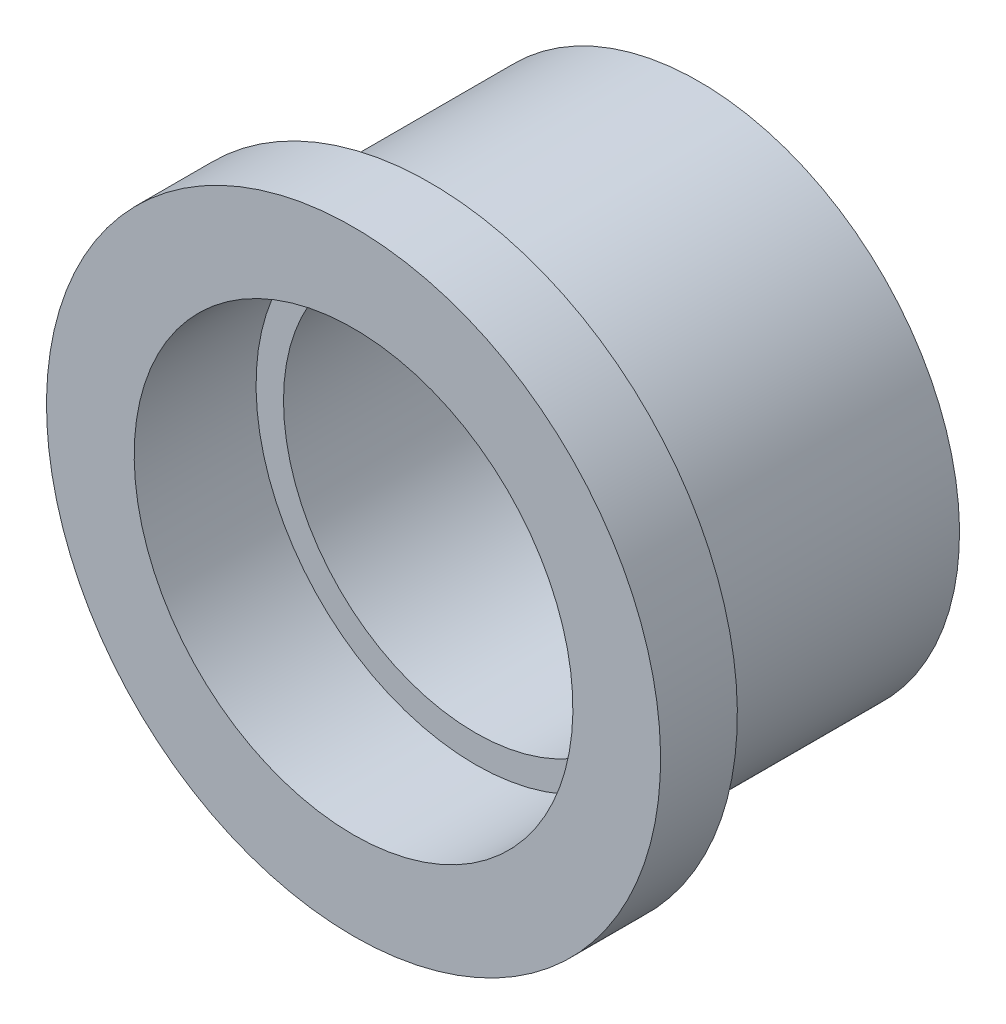
ISO-10303-21;
HEADER;
FILE_DESCRIPTION(('STEP AP214'),'2;1');
FILE_NAME('part.step','',(''),(''),'','','');
FILE_SCHEMA(('AUTOMOTIVE_DESIGN { 1 0 10303 214 1 1 1 1 }'));
ENDSEC;
DATA;
#1=APPLICATION_CONTEXT('core data for automotive mechanical design processes');
#2=APPLICATION_PROTOCOL_DEFINITION('international standard','automotive_design',2000,#1);
#3=PRODUCT_CONTEXT('',#1,'mechanical');
#4=PRODUCT('Part','Part','',(#3));
#5=PRODUCT_RELATED_PRODUCT_CATEGORY('part','',(#4));
#6=PRODUCT_DEFINITION_FORMATION('','',#4);
#7=PRODUCT_DEFINITION_CONTEXT('part definition',#1,'design');
#8=PRODUCT_DEFINITION('design','',#6,#7);
#9=PRODUCT_DEFINITION_SHAPE('','',#8);
#10=(LENGTH_UNIT() NAMED_UNIT(*) SI_UNIT(.MILLI.,.METRE.));
#11=(NAMED_UNIT(*) PLANE_ANGLE_UNIT() SI_UNIT($,.RADIAN.));
#12=(NAMED_UNIT(*) SI_UNIT($,.STERADIAN.) SOLID_ANGLE_UNIT());
#13=UNCERTAINTY_MEASURE_WITH_UNIT(LENGTH_MEASURE(1.E-05),#10,'distance_accuracy_value','');
#14=(GEOMETRIC_REPRESENTATION_CONTEXT(3) GLOBAL_UNCERTAINTY_ASSIGNED_CONTEXT((#13)) GLOBAL_UNIT_ASSIGNED_CONTEXT((#10,
#11,#12)) REPRESENTATION_CONTEXT('',''));
#15=CARTESIAN_POINT('',(0.,0.,0.));
#16=DIRECTION('',(0.,0.,1.));
#17=DIRECTION('',(1.,0.,0.));
#18=AXIS2_PLACEMENT_3D('',#15,#16,#17);
#19=CARTESIAN_POINT('',(0.,0.,0.));
#20=DIRECTION('',(0.,0.,1.));
#21=DIRECTION('',(0.,-1.,0.));
#22=AXIS2_PLACEMENT_3D('',#19,#20,#21);
#23=CYLINDRICAL_SURFACE('',#22,28.575);
#24=CARTESIAN_POINT('',(0.,0.,-15.875));
#25=DIRECTION('',(0.,0.,1.));
#26=DIRECTION('',(0.,-1.,0.));
#27=AXIS2_PLACEMENT_3D('',#24,#25,#26);
#28=CIRCLE('',#27,28.575);
#29=CARTESIAN_POINT('',(0.,-28.575,-15.875));
#30=VERTEX_POINT('',#29);
#31=EDGE_CURVE('E10',#30,#30,#28,.T.);
#32=ORIENTED_EDGE('',*,*,#31,.F.);
#33=EDGE_LOOP('',(#32));
#34=FACE_BOUND('',#33,.T.);
#35=CARTESIAN_POINT('',(0.,0.,0.));
#36=DIRECTION('',(0.,0.,1.));
#37=DIRECTION('',(0.,-1.,0.));
#38=AXIS2_PLACEMENT_3D('',#35,#36,#37);
#39=CIRCLE('',#38,28.575);
#40=CARTESIAN_POINT('',(0.,-28.575,0.));
#41=VERTEX_POINT('',#40);
#42=EDGE_CURVE('E59',#41,#41,#39,.T.);
#43=ORIENTED_EDGE('',*,*,#42,.T.);
#44=EDGE_LOOP('',(#43));
#45=FACE_BOUND('',#44,.T.);
#46=ADVANCED_FACE('F31',(#34,#45),#23,.F.);
#47=CARTESIAN_POINT('',(0.,25.,-15.875));
#48=DIRECTION('',(0.,0.,-1.));
#49=DIRECTION('',(0.,1.,0.));
#50=AXIS2_PLACEMENT_3D('',#47,#48,#49);
#51=PLANE('',#50);
#52=CARTESIAN_POINT('',(0.,0.,-15.875));
#53=DIRECTION('',(0.,0.,1.));
#54=DIRECTION('',(0.,-1.,0.));
#55=AXIS2_PLACEMENT_3D('',#52,#53,#54);
#56=CIRCLE('',#55,25.);
#57=CARTESIAN_POINT('',(0.,-25.,-15.875));
#58=VERTEX_POINT('',#57);
#59=EDGE_CURVE('E37',#58,#58,#56,.T.);
#60=ORIENTED_EDGE('',*,*,#59,.F.);
#61=EDGE_LOOP('',(#60));
#62=FACE_BOUND('',#61,.T.);
#63=ORIENTED_EDGE('',*,*,#31,.T.);
#64=EDGE_LOOP('',(#63));
#65=FACE_BOUND('',#64,.T.);
#66=ADVANCED_FACE('F96',(#62,#65),#51,.F.);
#67=CARTESIAN_POINT('',(0.,0.,0.));
#68=DIRECTION('',(0.,0.,1.));
#69=DIRECTION('',(0.,-1.,0.));
#70=AXIS2_PLACEMENT_3D('',#67,#68,#69);
#71=CYLINDRICAL_SURFACE('',#70,25.);
#72=CARTESIAN_POINT('',(0.,0.,-45.));
#73=DIRECTION('',(0.,0.,1.));
#74=DIRECTION('',(0.,-1.,0.));
#75=AXIS2_PLACEMENT_3D('',#72,#73,#74);
#76=CIRCLE('',#75,25.);
#77=CARTESIAN_POINT('',(0.,-25.,-45.));
#78=VERTEX_POINT('',#77);
#79=EDGE_CURVE('E41',#78,#78,#76,.T.);
#80=ORIENTED_EDGE('',*,*,#79,.F.);
#81=EDGE_LOOP('',(#80));
#82=FACE_BOUND('',#81,.T.);
#83=ORIENTED_EDGE('',*,*,#59,.T.);
#84=EDGE_LOOP('',(#83));
#85=FACE_BOUND('',#84,.T.);
#86=ADVANCED_FACE('F91',(#82,#85),#71,.F.);
#87=CARTESIAN_POINT('',(0.,25.,-45.));
#88=DIRECTION('',(0.,0.,1.));
#89=DIRECTION('',(0.,-1.,0.));
#90=AXIS2_PLACEMENT_3D('',#87,#88,#89);
#91=PLANE('',#90);
#92=CARTESIAN_POINT('',(0.,0.,-45.));
#93=DIRECTION('',(0.,0.,1.));
#94=DIRECTION('',(0.,-1.,0.));
#95=AXIS2_PLACEMENT_3D('',#92,#93,#94);
#96=CIRCLE('',#95,33.94);
#97=CARTESIAN_POINT('',(0.,-33.94,-45.));
#98=VERTEX_POINT('',#97);
#99=EDGE_CURVE('E45',#98,#98,#96,.T.);
#100=ORIENTED_EDGE('',*,*,#99,.F.);
#101=EDGE_LOOP('',(#100));
#102=FACE_BOUND('',#101,.T.);
#103=ORIENTED_EDGE('',*,*,#79,.T.);
#104=EDGE_LOOP('',(#103));
#105=FACE_BOUND('',#104,.T.);
#106=ADVANCED_FACE('F85',(#102,#105),#91,.F.);
#107=CARTESIAN_POINT('',(0.,0.,0.));
#108=DIRECTION('',(0.,0.,1.));
#109=DIRECTION('',(0.,-1.,0.));
#110=AXIS2_PLACEMENT_3D('',#107,#108,#109);
#111=CYLINDRICAL_SURFACE('',#110,33.94);
#112=CARTESIAN_POINT('',(0.,0.,-10.));
#113=DIRECTION('',(0.,0.,1.));
#114=DIRECTION('',(0.,-1.,0.));
#115=AXIS2_PLACEMENT_3D('',#112,#113,#114);
#116=CIRCLE('',#115,33.94);
#117=CARTESIAN_POINT('',(0.,-33.94,-10.));
#118=VERTEX_POINT('',#117);
#119=EDGE_CURVE('E50',#118,#118,#116,.T.);
#120=ORIENTED_EDGE('',*,*,#119,.F.);
#121=EDGE_LOOP('',(#120));
#122=FACE_BOUND('',#121,.T.);
#123=ORIENTED_EDGE('',*,*,#99,.T.);
#124=EDGE_LOOP('',(#123));
#125=FACE_BOUND('',#124,.T.);
#126=ADVANCED_FACE('F79',(#122,#125),#111,.T.);
#127=CARTESIAN_POINT('',(0.,33.94,-10.));
#128=DIRECTION('',(0.,0.,1.));
#129=DIRECTION('',(0.,-1.,0.));
#130=AXIS2_PLACEMENT_3D('',#127,#128,#129);
#131=PLANE('',#130);
#132=CARTESIAN_POINT('',(0.,0.,-10.));
#133=DIRECTION('',(0.,0.,1.));
#134=DIRECTION('',(0.,-1.,0.));
#135=AXIS2_PLACEMENT_3D('',#132,#133,#134);
#136=CIRCLE('',#135,40.);
#137=CARTESIAN_POINT('',(0.,-40.,-10.));
#138=VERTEX_POINT('',#137);
#139=EDGE_CURVE('E53',#138,#138,#136,.T.);
#140=ORIENTED_EDGE('',*,*,#139,.F.);
#141=EDGE_LOOP('',(#140));
#142=FACE_BOUND('',#141,.T.);
#143=ORIENTED_EDGE('',*,*,#119,.T.);
#144=EDGE_LOOP('',(#143));
#145=FACE_BOUND('',#144,.T.);
#146=ADVANCED_FACE('F73',(#142,#145),#131,.F.);
#147=CARTESIAN_POINT('',(0.,0.,0.));
#148=DIRECTION('',(0.,0.,1.));
#149=DIRECTION('',(0.,-1.,0.));
#150=AXIS2_PLACEMENT_3D('',#147,#148,#149);
#151=CYLINDRICAL_SURFACE('',#150,40.);
#152=CARTESIAN_POINT('',(0.,0.,0.));
#153=DIRECTION('',(0.,0.,1.));
#154=DIRECTION('',(0.,-1.,0.));
#155=AXIS2_PLACEMENT_3D('',#152,#153,#154);
#156=CIRCLE('',#155,40.);
#157=CARTESIAN_POINT('',(0.,-40.,0.));
#158=VERTEX_POINT('',#157);
#159=EDGE_CURVE('E56',#158,#158,#156,.T.);
#160=ORIENTED_EDGE('',*,*,#159,.F.);
#161=EDGE_LOOP('',(#160));
#162=FACE_BOUND('',#161,.T.);
#163=ORIENTED_EDGE('',*,*,#139,.T.);
#164=EDGE_LOOP('',(#163));
#165=FACE_BOUND('',#164,.T.);
#166=ADVANCED_FACE('F67',(#162,#165),#151,.T.);
#167=CARTESIAN_POINT('',(0.,40.,0.));
#168=DIRECTION('',(0.,0.,-1.));
#169=DIRECTION('',(0.,1.,0.));
#170=AXIS2_PLACEMENT_3D('',#167,#168,#169);
#171=PLANE('',#170);
#172=ORIENTED_EDGE('',*,*,#42,.F.);
#173=EDGE_LOOP('',(#172));
#174=FACE_BOUND('',#173,.T.);
#175=ORIENTED_EDGE('',*,*,#159,.T.);
#176=EDGE_LOOP('',(#175));
#177=FACE_BOUND('',#176,.T.);
#178=ADVANCED_FACE('F64',(#174,#177),#171,.F.);
#179=CLOSED_SHELL('',(#46,#66,#86,#106,#126,#146,#166,#178));
#180=MANIFOLD_SOLID_BREP('B2',#179);
#181=ADVANCED_BREP_SHAPE_REPRESENTATION('',(#18,#180),#14);
#182=SHAPE_DEFINITION_REPRESENTATION(#9,#181);
ENDSEC;
END-ISO-10303-21;
